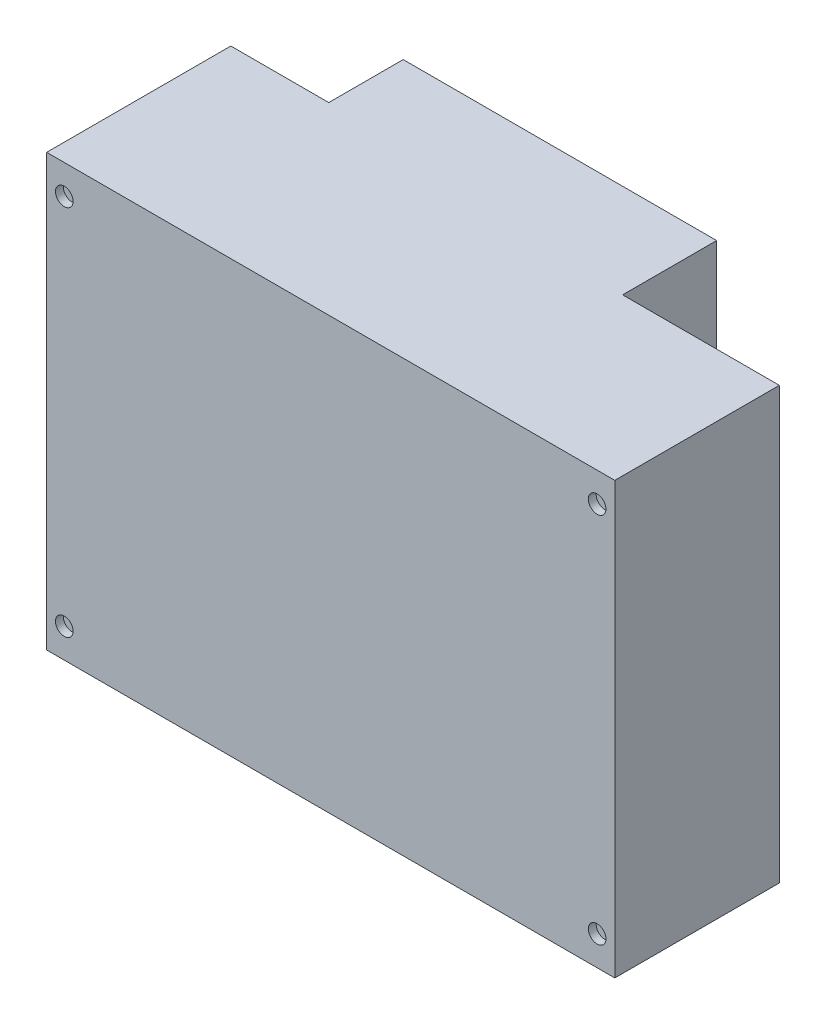
ISO-10303-21;
HEADER;
FILE_DESCRIPTION(('STEP AP214'),'2;1');
FILE_NAME('part.step','',(''),(''),'','','');
FILE_SCHEMA(('AUTOMOTIVE_DESIGN { 1 0 10303 214 1 1 1 1 }'));
ENDSEC;
DATA;
#1=APPLICATION_CONTEXT('core data for automotive mechanical design processes');
#2=APPLICATION_PROTOCOL_DEFINITION('international standard','automotive_design',2000,#1);
#3=PRODUCT_CONTEXT('',#1,'mechanical');
#4=PRODUCT('Part','Part','',(#3));
#5=PRODUCT_RELATED_PRODUCT_CATEGORY('part','',(#4));
#6=PRODUCT_DEFINITION_FORMATION('','',#4);
#7=PRODUCT_DEFINITION_CONTEXT('part definition',#1,'design');
#8=PRODUCT_DEFINITION('design','',#6,#7);
#9=PRODUCT_DEFINITION_SHAPE('','',#8);
#10=(LENGTH_UNIT() NAMED_UNIT(*) SI_UNIT(.MILLI.,.METRE.));
#11=(NAMED_UNIT(*) PLANE_ANGLE_UNIT() SI_UNIT($,.RADIAN.));
#12=(NAMED_UNIT(*) SI_UNIT($,.STERADIAN.) SOLID_ANGLE_UNIT());
#13=UNCERTAINTY_MEASURE_WITH_UNIT(LENGTH_MEASURE(1.E-05),#10,'distance_accuracy_value','');
#14=(GEOMETRIC_REPRESENTATION_CONTEXT(3) GLOBAL_UNCERTAINTY_ASSIGNED_CONTEXT((#13)) GLOBAL_UNIT_ASSIGNED_CONTEXT((#10,
#11,#12)) REPRESENTATION_CONTEXT('',''));
#15=CARTESIAN_POINT('',(0.,0.,0.));
#16=DIRECTION('',(0.,0.,1.));
#17=DIRECTION('',(1.,0.,0.));
#18=AXIS2_PLACEMENT_3D('',#15,#16,#17);
#19=CARTESIAN_POINT('',(0.,0.,2.));
#20=DIRECTION('',(0.,0.,-1.));
#21=DIRECTION('',(-1.,0.,0.));
#22=AXIS2_PLACEMENT_3D('',#19,#20,#21);
#23=PLANE('',#22);
#24=DIRECTION('',(0.,1.,0.));
#25=VECTOR('',#24,1.);
#26=CARTESIAN_POINT('',(72.5,-55.,2.));
#27=LINE('',#26,#25);
#28=CARTESIAN_POINT('',(72.5,-55.,2.));
#29=VERTEX_POINT('',#28);
#30=CARTESIAN_POINT('',(72.5,55.,2.));
#31=VERTEX_POINT('',#30);
#32=EDGE_CURVE('E101',#29,#31,#27,.T.);
#33=ORIENTED_EDGE('',*,*,#32,.T.);
#34=DIRECTION('',(-1.,0.,0.));
#35=VECTOR('',#34,1.);
#36=CARTESIAN_POINT('',(-72.5,55.,2.));
#37=LINE('',#36,#35);
#38=CARTESIAN_POINT('',(-72.5,55.,2.));
#39=VERTEX_POINT('',#38);
#40=EDGE_CURVE('E176',#31,#39,#37,.T.);
#41=ORIENTED_EDGE('',*,*,#40,.T.);
#42=DIRECTION('',(0.,-1.,0.));
#43=VECTOR('',#42,1.);
#44=CARTESIAN_POINT('',(-72.5,-55.,2.));
#45=LINE('',#44,#43);
#46=CARTESIAN_POINT('',(-72.5,-55.,2.));
#47=VERTEX_POINT('',#46);
#48=EDGE_CURVE('E52',#39,#47,#45,.T.);
#49=ORIENTED_EDGE('',*,*,#48,.T.);
#50=DIRECTION('',(1.,0.,0.));
#51=VECTOR('',#50,1.);
#52=CARTESIAN_POINT('',(-72.5,-55.,2.));
#53=LINE('',#52,#51);
#54=EDGE_CURVE('E47',#47,#29,#53,.T.);
#55=ORIENTED_EDGE('',*,*,#54,.T.);
#56=EDGE_LOOP('',(#33,#41,#49,#55));
#57=FACE_BOUND('',#56,.T.);
#58=CARTESIAN_POINT('',(-68.,-47.5,2.));
#59=DIRECTION('',(0.,0.,1.));
#60=DIRECTION('',(1.,0.,0.));
#61=AXIS2_PLACEMENT_3D('',#58,#59,#60);
#62=CIRCLE('',#61,2.25);
#63=CARTESIAN_POINT('',(-65.75,-47.5,2.));
#64=VERTEX_POINT('',#63);
#65=EDGE_CURVE('E170',#64,#64,#62,.T.);
#66=ORIENTED_EDGE('',*,*,#65,.F.);
#67=EDGE_LOOP('',(#66));
#68=FACE_BOUND('',#67,.T.);
#69=CARTESIAN_POINT('',(68.,-47.5,2.));
#70=DIRECTION('',(0.,0.,1.));
#71=DIRECTION('',(-1.,0.,0.));
#72=AXIS2_PLACEMENT_3D('',#69,#70,#71);
#73=CIRCLE('',#72,2.25);
#74=CARTESIAN_POINT('',(65.75,-47.5,2.));
#75=VERTEX_POINT('',#74);
#76=EDGE_CURVE('E164',#75,#75,#73,.T.);
#77=ORIENTED_EDGE('',*,*,#76,.F.);
#78=EDGE_LOOP('',(#77));
#79=FACE_BOUND('',#78,.T.);
#80=CARTESIAN_POINT('',(68.,47.5,2.));
#81=DIRECTION('',(0.,0.,1.));
#82=DIRECTION('',(1.,0.,0.));
#83=AXIS2_PLACEMENT_3D('',#80,#81,#82);
#84=CIRCLE('',#83,2.25);
#85=CARTESIAN_POINT('',(70.25,47.5,2.));
#86=VERTEX_POINT('',#85);
#87=EDGE_CURVE('E158',#86,#86,#84,.T.);
#88=ORIENTED_EDGE('',*,*,#87,.F.);
#89=EDGE_LOOP('',(#88));
#90=FACE_BOUND('',#89,.T.);
#91=CARTESIAN_POINT('',(-68.,47.5,2.));
#92=DIRECTION('',(0.,0.,1.));
#93=DIRECTION('',(-1.,0.,0.));
#94=AXIS2_PLACEMENT_3D('',#91,#92,#93);
#95=CIRCLE('',#94,2.25);
#96=CARTESIAN_POINT('',(-70.25,47.5,2.));
#97=VERTEX_POINT('',#96);
#98=EDGE_CURVE('E152',#97,#97,#95,.T.);
#99=ORIENTED_EDGE('',*,*,#98,.F.);
#100=EDGE_LOOP('',(#99));
#101=FACE_BOUND('',#100,.T.);
#102=ADVANCED_FACE('F32',(#57,#68,#79,#90,#101),#23,.F.);
#103=CARTESIAN_POINT('',(72.5,-55.,2.));
#104=DIRECTION('',(-1.,0.,0.));
#105=DIRECTION('',(0.,0.,1.));
#106=AXIS2_PLACEMENT_3D('',#103,#104,#105);
#107=PLANE('',#106);
#108=DIRECTION('',(0.,0.,-1.));
#109=VECTOR('',#108,1.);
#110=CARTESIAN_POINT('',(72.5,-55.,2.));
#111=LINE('',#110,#109);
#112=CARTESIAN_POINT('',(72.5,-55.,-40.));
#113=VERTEX_POINT('',#112);
#114=EDGE_CURVE('E96',#29,#113,#111,.T.);
#115=ORIENTED_EDGE('',*,*,#114,.T.);
#116=DIRECTION('',(0.,-1.,0.));
#117=VECTOR('',#116,1.);
#118=CARTESIAN_POINT('',(72.5,55.,-40.));
#119=LINE('',#118,#117);
#120=CARTESIAN_POINT('',(72.5,55.,-40.));
#121=VERTEX_POINT('',#120);
#122=EDGE_CURVE('E99',#121,#113,#119,.T.);
#123=ORIENTED_EDGE('',*,*,#122,.F.);
#124=DIRECTION('',(0.,0.,-1.));
#125=VECTOR('',#124,1.);
#126=CARTESIAN_POINT('',(72.5,55.,2.));
#127=LINE('',#126,#125);
#128=EDGE_CURVE('E11',#31,#121,#127,.T.);
#129=ORIENTED_EDGE('',*,*,#128,.F.);
#130=ORIENTED_EDGE('',*,*,#32,.F.);
#131=EDGE_LOOP('',(#115,#123,#129,#130));
#132=FACE_BOUND('',#131,.T.);
#133=ADVANCED_FACE('F34',(#132),#107,.F.);
#134=CARTESIAN_POINT('',(-72.5,55.,2.));
#135=DIRECTION('',(0.,-1.,0.));
#136=DIRECTION('',(0.,0.,-1.));
#137=AXIS2_PLACEMENT_3D('',#134,#135,#136);
#138=PLANE('',#137);
#139=ORIENTED_EDGE('',*,*,#128,.T.);
#140=DIRECTION('',(-1.,0.,0.));
#141=VECTOR('',#140,1.);
#142=CARTESIAN_POINT('',(32.5,55.,-40.));
#143=LINE('',#142,#141);
#144=CARTESIAN_POINT('',(32.5,55.,-40.));
#145=VERTEX_POINT('',#144);
#146=EDGE_CURVE('E111',#121,#145,#143,.T.);
#147=ORIENTED_EDGE('',*,*,#146,.T.);
#148=DIRECTION('',(0.,0.,-1.));
#149=VECTOR('',#148,1.);
#150=CARTESIAN_POINT('',(32.5,55.,-64.));
#151=LINE('',#150,#149);
#152=CARTESIAN_POINT('',(32.5,55.,-64.));
#153=VERTEX_POINT('',#152);
#154=EDGE_CURVE('E133',#145,#153,#151,.T.);
#155=ORIENTED_EDGE('',*,*,#154,.T.);
#156=DIRECTION('',(-1.,0.,0.));
#157=VECTOR('',#156,1.);
#158=CARTESIAN_POINT('',(-47.5,55.,-64.));
#159=LINE('',#158,#157);
#160=CARTESIAN_POINT('',(-47.5,55.,-64.));
#161=VERTEX_POINT('',#160);
#162=EDGE_CURVE('E135',#153,#161,#159,.T.);
#163=ORIENTED_EDGE('',*,*,#162,.T.);
#164=DIRECTION('',(0.,0.,1.));
#165=VECTOR('',#164,1.);
#166=CARTESIAN_POINT('',(-47.5,55.,-45.));
#167=LINE('',#166,#165);
#168=CARTESIAN_POINT('',(-47.5,55.,-45.));
#169=VERTEX_POINT('',#168);
#170=EDGE_CURVE('E137',#161,#169,#167,.T.);
#171=ORIENTED_EDGE('',*,*,#170,.T.);
#172=DIRECTION('',(-1.,0.,0.));
#173=VECTOR('',#172,1.);
#174=CARTESIAN_POINT('',(-72.5,55.,-45.));
#175=LINE('',#174,#173);
#176=CARTESIAN_POINT('',(-72.5,55.,-45.));
#177=VERTEX_POINT('',#176);
#178=EDGE_CURVE('E139',#169,#177,#175,.T.);
#179=ORIENTED_EDGE('',*,*,#178,.T.);
#180=DIRECTION('',(0.,0.,-1.));
#181=VECTOR('',#180,1.);
#182=CARTESIAN_POINT('',(-72.5,55.,2.));
#183=LINE('',#182,#181);
#184=EDGE_CURVE('E40',#39,#177,#183,.T.);
#185=ORIENTED_EDGE('',*,*,#184,.F.);
#186=ORIENTED_EDGE('',*,*,#40,.F.);
#187=EDGE_LOOP('',(#139,#147,#155,#163,#171,#179,#185,#186));
#188=FACE_BOUND('',#187,.T.);
#189=ADVANCED_FACE('F186',(#188),#138,.F.);
#190=CARTESIAN_POINT('',(-72.5,-55.,2.));
#191=DIRECTION('',(1.,0.,0.));
#192=DIRECTION('',(0.,0.,-1.));
#193=AXIS2_PLACEMENT_3D('',#190,#191,#192);
#194=PLANE('',#193);
#195=ORIENTED_EDGE('',*,*,#184,.T.);
#196=DIRECTION('',(0.,-1.,0.));
#197=VECTOR('',#196,1.);
#198=CARTESIAN_POINT('',(-72.5,55.,-45.));
#199=LINE('',#198,#197);
#200=CARTESIAN_POINT('',(-72.5,-55.,-45.));
#201=VERTEX_POINT('',#200);
#202=EDGE_CURVE('E142',#177,#201,#199,.T.);
#203=ORIENTED_EDGE('',*,*,#202,.T.);
#204=DIRECTION('',(0.,0.,-1.));
#205=VECTOR('',#204,1.);
#206=CARTESIAN_POINT('',(-72.5,-55.,2.));
#207=LINE('',#206,#205);
#208=EDGE_CURVE('E104',#47,#201,#207,.T.);
#209=ORIENTED_EDGE('',*,*,#208,.F.);
#210=ORIENTED_EDGE('',*,*,#48,.F.);
#211=EDGE_LOOP('',(#195,#203,#209,#210));
#212=FACE_BOUND('',#211,.T.);
#213=ADVANCED_FACE('F182',(#212),#194,.F.);
#214=CARTESIAN_POINT('',(-72.5,-55.,2.));
#215=DIRECTION('',(0.,1.,0.));
#216=DIRECTION('',(0.,0.,1.));
#217=AXIS2_PLACEMENT_3D('',#214,#215,#216);
#218=PLANE('',#217);
#219=ORIENTED_EDGE('',*,*,#208,.T.);
#220=DIRECTION('',(-1.,0.,0.));
#221=VECTOR('',#220,1.);
#222=CARTESIAN_POINT('',(-72.5,-55.,-45.));
#223=LINE('',#222,#221);
#224=CARTESIAN_POINT('',(-47.5,-55.,-45.));
#225=VERTEX_POINT('',#224);
#226=EDGE_CURVE('E129',#225,#201,#223,.T.);
#227=ORIENTED_EDGE('',*,*,#226,.F.);
#228=DIRECTION('',(0.,0.,1.));
#229=VECTOR('',#228,1.);
#230=CARTESIAN_POINT('',(-47.5,-55.,-45.));
#231=LINE('',#230,#229);
#232=CARTESIAN_POINT('',(-47.5,-55.,-64.));
#233=VERTEX_POINT('',#232);
#234=EDGE_CURVE('E126',#233,#225,#231,.T.);
#235=ORIENTED_EDGE('',*,*,#234,.F.);
#236=DIRECTION('',(-1.,0.,0.));
#237=VECTOR('',#236,1.);
#238=CARTESIAN_POINT('',(-47.5,-55.,-64.));
#239=LINE('',#238,#237);
#240=CARTESIAN_POINT('',(32.5,-55.,-64.));
#241=VERTEX_POINT('',#240);
#242=EDGE_CURVE('E121',#241,#233,#239,.T.);
#243=ORIENTED_EDGE('',*,*,#242,.F.);
#244=DIRECTION('',(0.,0.,-1.));
#245=VECTOR('',#244,1.);
#246=CARTESIAN_POINT('',(32.5,-55.,-64.));
#247=LINE('',#246,#245);
#248=CARTESIAN_POINT('',(32.5,-55.,-40.));
#249=VERTEX_POINT('',#248);
#250=EDGE_CURVE('E119',#249,#241,#247,.T.);
#251=ORIENTED_EDGE('',*,*,#250,.F.);
#252=DIRECTION('',(-1.,0.,0.));
#253=VECTOR('',#252,1.);
#254=CARTESIAN_POINT('',(32.5,-55.,-40.));
#255=LINE('',#254,#253);
#256=EDGE_CURVE('E110',#113,#249,#255,.T.);
#257=ORIENTED_EDGE('',*,*,#256,.F.);
#258=ORIENTED_EDGE('',*,*,#114,.F.);
#259=ORIENTED_EDGE('',*,*,#54,.F.);
#260=EDGE_LOOP('',(#219,#227,#235,#243,#251,#257,#258,#259));
#261=FACE_BOUND('',#260,.T.);
#262=ADVANCED_FACE('F116',(#261),#218,.F.);
#263=CARTESIAN_POINT('',(-68.,-47.5,2.));
#264=DIRECTION('',(0.,0.,-1.));
#265=DIRECTION('',(-1.,0.,0.));
#266=AXIS2_PLACEMENT_3D('',#263,#264,#265);
#267=CYLINDRICAL_SURFACE('',#266,2.25);
#268=ORIENTED_EDGE('',*,*,#65,.T.);
#269=EDGE_LOOP('',(#268));
#270=FACE_BOUND('',#269,.T.);
#271=CARTESIAN_POINT('',(-68.,-47.5,0.));
#272=DIRECTION('',(0.,0.,1.));
#273=DIRECTION('',(1.,0.,0.));
#274=AXIS2_PLACEMENT_3D('',#271,#272,#273);
#275=CIRCLE('',#274,2.25);
#276=CARTESIAN_POINT('',(-65.75,-47.5,0.));
#277=VERTEX_POINT('',#276);
#278=EDGE_CURVE('E167',#277,#277,#275,.T.);
#279=ORIENTED_EDGE('',*,*,#278,.F.);
#280=EDGE_LOOP('',(#279));
#281=FACE_BOUND('',#280,.T.);
#282=ADVANCED_FACE('F241',(#270,#281),#267,.F.);
#283=CARTESIAN_POINT('',(68.,-47.5,2.));
#284=DIRECTION('',(0.,0.,-1.));
#285=DIRECTION('',(-1.,0.,0.));
#286=AXIS2_PLACEMENT_3D('',#283,#284,#285);
#287=CYLINDRICAL_SURFACE('',#286,2.25);
#288=ORIENTED_EDGE('',*,*,#76,.T.);
#289=EDGE_LOOP('',(#288));
#290=FACE_BOUND('',#289,.T.);
#291=CARTESIAN_POINT('',(68.,-47.5,0.));
#292=DIRECTION('',(0.,0.,1.));
#293=DIRECTION('',(-1.,0.,0.));
#294=AXIS2_PLACEMENT_3D('',#291,#292,#293);
#295=CIRCLE('',#294,2.25);
#296=CARTESIAN_POINT('',(65.75,-47.5,0.));
#297=VERTEX_POINT('',#296);
#298=EDGE_CURVE('E161',#297,#297,#295,.T.);
#299=ORIENTED_EDGE('',*,*,#298,.F.);
#300=EDGE_LOOP('',(#299));
#301=FACE_BOUND('',#300,.T.);
#302=ADVANCED_FACE('F243',(#290,#301),#287,.F.);
#303=CARTESIAN_POINT('',(68.,47.5,2.));
#304=DIRECTION('',(0.,0.,-1.));
#305=DIRECTION('',(-1.,0.,0.));
#306=AXIS2_PLACEMENT_3D('',#303,#304,#305);
#307=CYLINDRICAL_SURFACE('',#306,2.25);
#308=ORIENTED_EDGE('',*,*,#87,.T.);
#309=EDGE_LOOP('',(#308));
#310=FACE_BOUND('',#309,.T.);
#311=CARTESIAN_POINT('',(68.,47.5,0.));
#312=DIRECTION('',(0.,0.,1.));
#313=DIRECTION('',(1.,0.,0.));
#314=AXIS2_PLACEMENT_3D('',#311,#312,#313);
#315=CIRCLE('',#314,2.25);
#316=CARTESIAN_POINT('',(70.25,47.5,0.));
#317=VERTEX_POINT('',#316);
#318=EDGE_CURVE('E155',#317,#317,#315,.T.);
#319=ORIENTED_EDGE('',*,*,#318,.F.);
#320=EDGE_LOOP('',(#319));
#321=FACE_BOUND('',#320,.T.);
#322=ADVANCED_FACE('F218',(#310,#321),#307,.F.);
#323=CARTESIAN_POINT('',(-68.,47.5,2.));
#324=DIRECTION('',(0.,0.,-1.));
#325=DIRECTION('',(-1.,0.,0.));
#326=AXIS2_PLACEMENT_3D('',#323,#324,#325);
#327=CYLINDRICAL_SURFACE('',#326,2.25);
#328=ORIENTED_EDGE('',*,*,#98,.T.);
#329=EDGE_LOOP('',(#328));
#330=FACE_BOUND('',#329,.T.);
#331=CARTESIAN_POINT('',(-68.,47.5,0.));
#332=DIRECTION('',(0.,0.,1.));
#333=DIRECTION('',(-1.,0.,0.));
#334=AXIS2_PLACEMENT_3D('',#331,#332,#333);
#335=CIRCLE('',#334,2.25);
#336=CARTESIAN_POINT('',(-70.25,47.5,0.));
#337=VERTEX_POINT('',#336);
#338=EDGE_CURVE('E112',#337,#337,#335,.T.);
#339=ORIENTED_EDGE('',*,*,#338,.F.);
#340=EDGE_LOOP('',(#339));
#341=FACE_BOUND('',#340,.T.);
#342=ADVANCED_FACE('F214',(#330,#341),#327,.F.);
#343=CARTESIAN_POINT('',(72.5,55.,0.));
#344=DIRECTION('',(0.,0.,-1.));
#345=DIRECTION('',(-1.,0.,0.));
#346=AXIS2_PLACEMENT_3D('',#343,#344,#345);
#347=PLANE('',#346);
#348=ORIENTED_EDGE('',*,*,#338,.T.);
#349=EDGE_LOOP('',(#348));
#350=FACE_BOUND('',#349,.T.);
#351=ADVANCED_FACE('F217',(#350),#347,.F.);
#352=ORIENTED_EDGE('',*,*,#318,.T.);
#353=EDGE_LOOP('',(#352));
#354=FACE_BOUND('',#353,.T.);
#355=ADVANCED_FACE('F223',(#354),#347,.F.);
#356=ORIENTED_EDGE('',*,*,#298,.T.);
#357=EDGE_LOOP('',(#356));
#358=FACE_BOUND('',#357,.T.);
#359=ADVANCED_FACE('F229',(#358),#347,.F.);
#360=ORIENTED_EDGE('',*,*,#278,.T.);
#361=EDGE_LOOP('',(#360));
#362=FACE_BOUND('',#361,.T.);
#363=ADVANCED_FACE('F225',(#362),#347,.F.);
#364=CARTESIAN_POINT('',(32.5,55.,-40.));
#365=DIRECTION('',(0.,0.,1.));
#366=DIRECTION('',(1.,0.,0.));
#367=AXIS2_PLACEMENT_3D('',#364,#365,#366);
#368=PLANE('',#367);
#369=ORIENTED_EDGE('',*,*,#122,.T.);
#370=ORIENTED_EDGE('',*,*,#256,.T.);
#371=DIRECTION('',(0.,-1.,0.));
#372=VECTOR('',#371,1.);
#373=CARTESIAN_POINT('',(32.5,55.,-40.));
#374=LINE('',#373,#372);
#375=EDGE_CURVE('E113',#145,#249,#374,.T.);
#376=ORIENTED_EDGE('',*,*,#375,.F.);
#377=ORIENTED_EDGE('',*,*,#146,.F.);
#378=EDGE_LOOP('',(#369,#370,#376,#377));
#379=FACE_BOUND('',#378,.T.);
#380=ADVANCED_FACE('F108',(#379),#368,.F.);
#381=CARTESIAN_POINT('',(32.5,55.,-64.));
#382=DIRECTION('',(-1.,0.,0.));
#383=DIRECTION('',(0.,0.,1.));
#384=AXIS2_PLACEMENT_3D('',#381,#382,#383);
#385=PLANE('',#384);
#386=ORIENTED_EDGE('',*,*,#375,.T.);
#387=ORIENTED_EDGE('',*,*,#250,.T.);
#388=DIRECTION('',(0.,-1.,0.));
#389=VECTOR('',#388,1.);
#390=CARTESIAN_POINT('',(32.5,55.,-64.));
#391=LINE('',#390,#389);
#392=EDGE_CURVE('E149',#153,#241,#391,.T.);
#393=ORIENTED_EDGE('',*,*,#392,.F.);
#394=ORIENTED_EDGE('',*,*,#154,.F.);
#395=EDGE_LOOP('',(#386,#387,#393,#394));
#396=FACE_BOUND('',#395,.T.);
#397=ADVANCED_FACE('F201',(#396),#385,.F.);
#398=CARTESIAN_POINT('',(-47.5,55.,-64.));
#399=DIRECTION('',(0.,0.,1.));
#400=DIRECTION('',(1.,0.,0.));
#401=AXIS2_PLACEMENT_3D('',#398,#399,#400);
#402=PLANE('',#401);
#403=ORIENTED_EDGE('',*,*,#392,.T.);
#404=ORIENTED_EDGE('',*,*,#242,.T.);
#405=DIRECTION('',(0.,-1.,0.));
#406=VECTOR('',#405,1.);
#407=CARTESIAN_POINT('',(-47.5,55.,-64.));
#408=LINE('',#407,#406);
#409=EDGE_CURVE('E147',#161,#233,#408,.T.);
#410=ORIENTED_EDGE('',*,*,#409,.F.);
#411=ORIENTED_EDGE('',*,*,#162,.F.);
#412=EDGE_LOOP('',(#403,#404,#410,#411));
#413=FACE_BOUND('',#412,.T.);
#414=ADVANCED_FACE('F198',(#413),#402,.F.);
#415=CARTESIAN_POINT('',(-47.5,55.,-45.));
#416=DIRECTION('',(1.,0.,0.));
#417=DIRECTION('',(0.,0.,-1.));
#418=AXIS2_PLACEMENT_3D('',#415,#416,#417);
#419=PLANE('',#418);
#420=ORIENTED_EDGE('',*,*,#409,.T.);
#421=ORIENTED_EDGE('',*,*,#234,.T.);
#422=DIRECTION('',(0.,-1.,0.));
#423=VECTOR('',#422,1.);
#424=CARTESIAN_POINT('',(-47.5,55.,-45.));
#425=LINE('',#424,#423);
#426=EDGE_CURVE('E145',#169,#225,#425,.T.);
#427=ORIENTED_EDGE('',*,*,#426,.F.);
#428=ORIENTED_EDGE('',*,*,#170,.F.);
#429=EDGE_LOOP('',(#420,#421,#427,#428));
#430=FACE_BOUND('',#429,.T.);
#431=ADVANCED_FACE('F194',(#430),#419,.F.);
#432=CARTESIAN_POINT('',(-72.5,55.,-45.));
#433=DIRECTION('',(0.,0.,1.));
#434=DIRECTION('',(1.,0.,0.));
#435=AXIS2_PLACEMENT_3D('',#432,#433,#434);
#436=PLANE('',#435);
#437=ORIENTED_EDGE('',*,*,#426,.T.);
#438=ORIENTED_EDGE('',*,*,#226,.T.);
#439=ORIENTED_EDGE('',*,*,#202,.F.);
#440=ORIENTED_EDGE('',*,*,#178,.F.);
#441=EDGE_LOOP('',(#437,#438,#439,#440));
#442=FACE_BOUND('',#441,.T.);
#443=ADVANCED_FACE('F190',(#442),#436,.F.);
#444=CLOSED_SHELL('',(#102,#133,#189,#213,#262,#282,#302,#322,#342,#351,#355,#359,#363,#380,
#397,#414,#431,#443));
#445=MANIFOLD_SOLID_BREP('B2',#444);
#446=ADVANCED_BREP_SHAPE_REPRESENTATION('',(#18,#445),#14);
#447=SHAPE_DEFINITION_REPRESENTATION(#9,#446);
ENDSEC;
END-ISO-10303-21;
